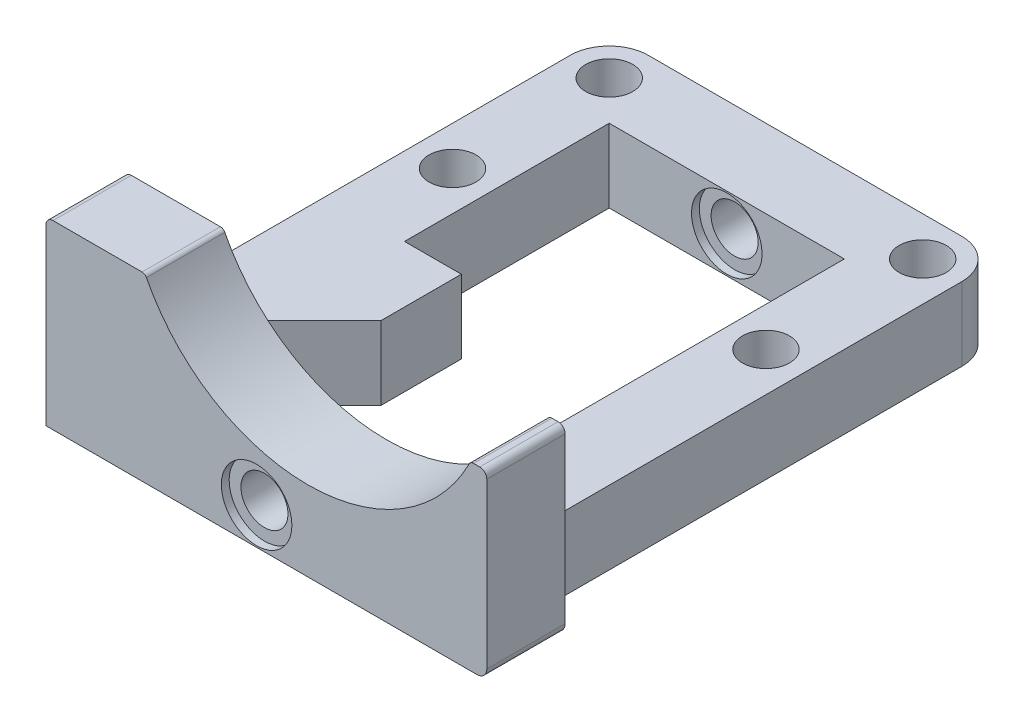
ISO-10303-21;
HEADER;
FILE_DESCRIPTION(('STEP AP214'),'2;1');
FILE_NAME('part.step','',(''),(''),'','','');
FILE_SCHEMA(('AUTOMOTIVE_DESIGN { 1 0 10303 214 1 1 1 1 }'));
ENDSEC;
DATA;
#1=APPLICATION_CONTEXT('core data for automotive mechanical design processes');
#2=APPLICATION_PROTOCOL_DEFINITION('international standard','automotive_design',2000,#1);
#3=PRODUCT_CONTEXT('',#1,'mechanical');
#4=PRODUCT('Part','Part','',(#3));
#5=PRODUCT_RELATED_PRODUCT_CATEGORY('part','',(#4));
#6=PRODUCT_DEFINITION_FORMATION('','',#4);
#7=PRODUCT_DEFINITION_CONTEXT('part definition',#1,'design');
#8=PRODUCT_DEFINITION('design','',#6,#7);
#9=PRODUCT_DEFINITION_SHAPE('','',#8);
#10=(LENGTH_UNIT() NAMED_UNIT(*) SI_UNIT(.MILLI.,.METRE.));
#11=(NAMED_UNIT(*) PLANE_ANGLE_UNIT() SI_UNIT($,.RADIAN.));
#12=(NAMED_UNIT(*) SI_UNIT($,.STERADIAN.) SOLID_ANGLE_UNIT());
#13=UNCERTAINTY_MEASURE_WITH_UNIT(LENGTH_MEASURE(1.E-05),#10,'distance_accuracy_value','');
#14=(GEOMETRIC_REPRESENTATION_CONTEXT(3) GLOBAL_UNCERTAINTY_ASSIGNED_CONTEXT((#13)) GLOBAL_UNIT_ASSIGNED_CONTEXT((#10,
#11,#12)) REPRESENTATION_CONTEXT('',''));
#15=CARTESIAN_POINT('',(0.,0.,0.));
#16=DIRECTION('',(0.,0.,1.));
#17=DIRECTION('',(1.,0.,0.));
#18=AXIS2_PLACEMENT_3D('',#15,#16,#17);
#19=CARTESIAN_POINT('',(-12.,8.,-146.));
#20=DIRECTION('',(-1.,0.,0.));
#21=DIRECTION('',(0.,1.,0.));
#22=AXIS2_PLACEMENT_3D('',#19,#20,#21);
#23=PLANE('',#22);
#24=DIRECTION('',(0.,0.,-1.));
#25=VECTOR('',#24,1.);
#26=CARTESIAN_POINT('',(-12.,0.25,-146.));
#27=LINE('',#26,#25);
#28=CARTESIAN_POINT('',(-12.,0.25,-136.));
#29=VERTEX_POINT('',#28);
#30=CARTESIAN_POINT('',(-12.,0.25,-141.1));
#31=VERTEX_POINT('',#30);
#32=EDGE_CURVE('E386',#29,#31,#27,.T.);
#33=ORIENTED_EDGE('',*,*,#32,.T.);
#34=DIRECTION('',(0.,1.,0.));
#35=VECTOR('',#34,1.);
#36=CARTESIAN_POINT('',(-12.,8.,-141.1));
#37=LINE('',#36,#35);
#38=CARTESIAN_POINT('',(-12.,7.75,-141.1));
#39=VERTEX_POINT('',#38);
#40=EDGE_CURVE('E478',#31,#39,#37,.T.);
#41=ORIENTED_EDGE('',*,*,#40,.T.);
#42=DIRECTION('',(0.,0.,1.));
#43=VECTOR('',#42,1.);
#44=CARTESIAN_POINT('',(-12.,7.75,-146.));
#45=LINE('',#44,#43);
#46=CARTESIAN_POINT('',(-12.,7.75,-136.));
#47=VERTEX_POINT('',#46);
#48=EDGE_CURVE('E363',#39,#47,#45,.T.);
#49=ORIENTED_EDGE('',*,*,#48,.T.);
#50=DIRECTION('',(0.,-1.,0.));
#51=VECTOR('',#50,1.);
#52=CARTESIAN_POINT('',(-12.,8.,-136.));
#53=LINE('',#52,#51);
#54=EDGE_CURVE('E439',#47,#29,#53,.T.);
#55=ORIENTED_EDGE('',*,*,#54,.T.);
#56=EDGE_LOOP('',(#33,#41,#49,#55));
#57=FACE_BOUND('',#56,.T.);
#58=ADVANCED_FACE('F43',(#57),#23,.F.);
#59=CARTESIAN_POINT('',(20.,8.,-144.));
#60=DIRECTION('',(-1.,0.,0.));
#61=DIRECTION('',(0.,0.,1.));
#62=AXIS2_PLACEMENT_3D('',#59,#60,#61);
#63=PLANE('',#62);
#64=DIRECTION('',(0.,1.,0.));
#65=VECTOR('',#64,1.);
#66=CARTESIAN_POINT('',(20.,8.,-136.));
#67=LINE('',#66,#65);
#68=CARTESIAN_POINT('',(20.,0.25,-136.));
#69=VERTEX_POINT('',#68);
#70=CARTESIAN_POINT('',(20.,7.75,-136.));
#71=VERTEX_POINT('',#70);
#72=EDGE_CURVE('E347',#69,#71,#67,.T.);
#73=ORIENTED_EDGE('',*,*,#72,.F.);
#74=DIRECTION('',(0.,0.,-1.));
#75=VECTOR('',#74,1.);
#76=CARTESIAN_POINT('',(20.,0.25,-144.));
#77=LINE('',#76,#75);
#78=CARTESIAN_POINT('',(20.,0.25,-180.));
#79=VERTEX_POINT('',#78);
#80=EDGE_CURVE('E380',#69,#79,#77,.T.);
#81=ORIENTED_EDGE('',*,*,#80,.T.);
#82=DIRECTION('',(0.,-1.,0.));
#83=VECTOR('',#82,1.);
#84=CARTESIAN_POINT('',(20.,8.,-180.));
#85=LINE('',#84,#83);
#86=CARTESIAN_POINT('',(20.,7.75,-180.));
#87=VERTEX_POINT('',#86);
#88=EDGE_CURVE('E408',#87,#79,#85,.T.);
#89=ORIENTED_EDGE('',*,*,#88,.F.);
#90=DIRECTION('',(0.,0.,1.));
#91=VECTOR('',#90,1.);
#92=CARTESIAN_POINT('',(20.,7.75,-144.));
#93=LINE('',#92,#91);
#94=EDGE_CURVE('E357',#87,#71,#93,.T.);
#95=ORIENTED_EDGE('',*,*,#94,.T.);
#96=EDGE_LOOP('',(#73,#81,#89,#95));
#97=FACE_BOUND('',#96,.T.);
#98=ADVANCED_FACE('F510',(#97),#63,.F.);
#99=CARTESIAN_POINT('',(-20.,8.,-144.));
#100=DIRECTION('',(1.,0.,0.));
#101=DIRECTION('',(0.,0.,1.));
#102=AXIS2_PLACEMENT_3D('',#99,#100,#101);
#103=PLANE('',#102);
#104=DIRECTION('',(0.,-1.,0.));
#105=VECTOR('',#104,1.);
#106=CARTESIAN_POINT('',(-20.,8.,-136.));
#107=LINE('',#106,#105);
#108=CARTESIAN_POINT('',(-20.,7.75,-136.));
#109=VERTEX_POINT('',#108);
#110=CARTESIAN_POINT('',(-20.,0.25,-136.));
#111=VERTEX_POINT('',#110);
#112=EDGE_CURVE('E325',#109,#111,#107,.T.);
#113=ORIENTED_EDGE('',*,*,#112,.F.);
#114=DIRECTION('',(0.,0.,-1.));
#115=VECTOR('',#114,1.);
#116=CARTESIAN_POINT('',(-20.,7.75,-144.));
#117=LINE('',#116,#115);
#118=CARTESIAN_POINT('',(-20.,7.75,-180.));
#119=VERTEX_POINT('',#118);
#120=EDGE_CURVE('E352',#109,#119,#117,.T.);
#121=ORIENTED_EDGE('',*,*,#120,.T.);
#122=DIRECTION('',(0.,-1.,0.));
#123=VECTOR('',#122,1.);
#124=CARTESIAN_POINT('',(-20.,8.,-180.));
#125=LINE('',#124,#123);
#126=CARTESIAN_POINT('',(-20.,0.25,-180.));
#127=VERTEX_POINT('',#126);
#128=EDGE_CURVE('E398',#119,#127,#125,.T.);
#129=ORIENTED_EDGE('',*,*,#128,.T.);
#130=DIRECTION('',(0.,0.,1.));
#131=VECTOR('',#130,1.);
#132=CARTESIAN_POINT('',(-20.,0.25,-144.));
#133=LINE('',#132,#131);
#134=EDGE_CURVE('E372',#127,#111,#133,.T.);
#135=ORIENTED_EDGE('',*,*,#134,.T.);
#136=EDGE_LOOP('',(#113,#121,#129,#135));
#137=FACE_BOUND('',#136,.T.);
#138=ADVANCED_FACE('F529',(#137),#103,.F.);
#139=CARTESIAN_POINT('',(0.,7.75,0.));
#140=DIRECTION('',(0.,-1.,0.));
#141=DIRECTION('',(0.,0.,-1.));
#142=AXIS2_PLACEMENT_3D('',#139,#140,#141);
#143=PLANE('',#142);
#144=ORIENTED_EDGE('',*,*,#48,.F.);
#145=DIRECTION('',(0.707106781186543,0.,-0.707106781186552));
#146=VECTOR('',#145,1.);
#147=CARTESIAN_POINT('',(-76.55,7.75,-76.5499999999991));
#148=LINE('',#147,#146);
#149=CARTESIAN_POINT('',(-6.2,7.75,-146.9));
#150=VERTEX_POINT('',#149);
#151=EDGE_CURVE('E225',#39,#150,#148,.T.);
#152=ORIENTED_EDGE('',*,*,#151,.T.);
#153=DIRECTION('',(0.,0.,-1.));
#154=VECTOR('',#153,1.);
#155=CARTESIAN_POINT('',(-6.2,7.75,-147.1));
#156=LINE('',#155,#154);
#157=CARTESIAN_POINT('',(-6.2,7.75,-155.1));
#158=VERTEX_POINT('',#157);
#159=EDGE_CURVE('E209',#150,#158,#156,.T.);
#160=ORIENTED_EDGE('',*,*,#159,.T.);
#161=DIRECTION('',(-1.,0.,0.));
#162=VECTOR('',#161,1.);
#163=CARTESIAN_POINT('',(-6.2,7.75,-155.1));
#164=LINE('',#163,#162);
#165=CARTESIAN_POINT('',(-12.,7.75,-155.1));
#166=VERTEX_POINT('',#165);
#167=EDGE_CURVE('E213',#158,#166,#164,.T.);
#168=ORIENTED_EDGE('',*,*,#167,.T.);
#169=CARTESIAN_POINT('',(-12.,7.75,-176.));
#170=VERTEX_POINT('',#169);
#171=EDGE_CURVE('E364',#170,#166,#45,.T.);
#172=ORIENTED_EDGE('',*,*,#171,.F.);
#173=DIRECTION('',(-1.,0.,0.));
#174=VECTOR('',#173,1.);
#175=CARTESIAN_POINT('',(6.,7.75,-176.));
#176=LINE('',#175,#174);
#177=CARTESIAN_POINT('',(12.,7.75,-176.));
#178=VERTEX_POINT('',#177);
#179=EDGE_CURVE('E360',#178,#170,#176,.T.);
#180=ORIENTED_EDGE('',*,*,#179,.F.);
#181=DIRECTION('',(0.,0.,-1.));
#182=VECTOR('',#181,1.);
#183=CARTESIAN_POINT('',(12.,7.75,-146.));
#184=LINE('',#183,#182);
#185=CARTESIAN_POINT('',(12.,7.75,-136.));
#186=VERTEX_POINT('',#185);
#187=EDGE_CURVE('E366',#186,#178,#184,.T.);
#188=ORIENTED_EDGE('',*,*,#187,.F.);
#189=DIRECTION('',(-1.,0.,0.));
#190=VECTOR('',#189,1.);
#191=CARTESIAN_POINT('',(0.,7.75,-136.));
#192=LINE('',#191,#190);
#193=EDGE_CURVE('E477',#71,#186,#192,.T.);
#194=ORIENTED_EDGE('',*,*,#193,.F.);
#195=ORIENTED_EDGE('',*,*,#94,.F.);
#196=CARTESIAN_POINT('',(16.,7.75,-180.));
#197=DIRECTION('',(0.,-1.,0.));
#198=DIRECTION('',(0.,0.,-1.));
#199=AXIS2_PLACEMENT_3D('',#196,#197,#198);
#200=CIRCLE('',#199,4.);
#201=CARTESIAN_POINT('',(16.,7.75,-184.));
#202=VERTEX_POINT('',#201);
#203=EDGE_CURVE('E354',#202,#87,#200,.T.);
#204=ORIENTED_EDGE('',*,*,#203,.F.);
#205=DIRECTION('',(1.,0.,0.));
#206=VECTOR('',#205,1.);
#207=CARTESIAN_POINT('',(6.,7.75,-184.));
#208=LINE('',#207,#206);
#209=CARTESIAN_POINT('',(-16.,7.75,-184.));
#210=VERTEX_POINT('',#209);
#211=EDGE_CURVE('E349',#210,#202,#208,.T.);
#212=ORIENTED_EDGE('',*,*,#211,.F.);
#213=CARTESIAN_POINT('',(-16.,7.75,-180.));
#214=DIRECTION('',(0.,-1.,0.));
#215=DIRECTION('',(0.,0.,-1.));
#216=AXIS2_PLACEMENT_3D('',#213,#214,#215);
#217=CIRCLE('',#216,4.);
#218=EDGE_CURVE('E472',#119,#210,#217,.T.);
#219=ORIENTED_EDGE('',*,*,#218,.F.);
#220=ORIENTED_EDGE('',*,*,#120,.F.);
#221=EDGE_CURVE('E475',#47,#109,#192,.T.);
#222=ORIENTED_EDGE('',*,*,#221,.F.);
#223=EDGE_LOOP('',(#144,#152,#160,#168,#172,#180,#188,#194,#195,#204,#212,#219,#220,#222));
#224=FACE_BOUND('',#223,.T.);
#225=CARTESIAN_POINT('',(16.,7.75,-180.));
#226=DIRECTION('',(0.,-1.,0.));
#227=DIRECTION('',(0.,0.,-1.));
#228=AXIS2_PLACEMENT_3D('',#225,#226,#227);
#229=CIRCLE('',#228,2.4);
#230=CARTESIAN_POINT('',(16.,7.75,-182.4));
#231=VERTEX_POINT('',#230);
#232=EDGE_CURVE('E254',#231,#231,#229,.F.);
#233=ORIENTED_EDGE('',*,*,#232,.F.);
#234=EDGE_LOOP('',(#233));
#235=FACE_BOUND('',#234,.T.);
#236=CARTESIAN_POINT('',(-16.,7.75,-180.));
#237=DIRECTION('',(0.,-1.,0.));
#238=DIRECTION('',(0.,0.,-1.));
#239=AXIS2_PLACEMENT_3D('',#236,#237,#238);
#240=CIRCLE('',#239,2.4);
#241=CARTESIAN_POINT('',(-16.,7.75,-182.4));
#242=VERTEX_POINT('',#241);
#243=EDGE_CURVE('E248',#242,#242,#240,.F.);
#244=ORIENTED_EDGE('',*,*,#243,.F.);
#245=EDGE_LOOP('',(#244));
#246=FACE_BOUND('',#245,.T.);
#247=CARTESIAN_POINT('',(-16.,7.75,-164.));
#248=DIRECTION('',(0.,-1.,0.));
#249=DIRECTION('',(0.,0.,-1.));
#250=AXIS2_PLACEMENT_3D('',#247,#248,#249);
#251=CIRCLE('',#250,2.4);
#252=CARTESIAN_POINT('',(-16.,7.75,-166.4));
#253=VERTEX_POINT('',#252);
#254=EDGE_CURVE('E242',#253,#253,#251,.F.);
#255=ORIENTED_EDGE('',*,*,#254,.F.);
#256=EDGE_LOOP('',(#255));
#257=FACE_BOUND('',#256,.T.);
#258=CARTESIAN_POINT('',(16.,7.75,-164.));
#259=DIRECTION('',(0.,-1.,0.));
#260=DIRECTION('',(0.,0.,-1.));
#261=AXIS2_PLACEMENT_3D('',#258,#259,#260);
#262=CIRCLE('',#261,2.4);
#263=CARTESIAN_POINT('',(16.,7.75,-166.4));
#264=VERTEX_POINT('',#263);
#265=EDGE_CURVE('E236',#264,#264,#262,.F.);
#266=ORIENTED_EDGE('',*,*,#265,.F.);
#267=EDGE_LOOP('',(#266));
#268=FACE_BOUND('',#267,.T.);
#269=ADVANCED_FACE('F223',(#224,#235,#246,#257,#268),#143,.F.);
#270=CARTESIAN_POINT('',(12.,8.,-146.));
#271=DIRECTION('',(1.,0.,0.));
#272=DIRECTION('',(0.,1.,0.));
#273=AXIS2_PLACEMENT_3D('',#270,#271,#272);
#274=PLANE('',#273);
#275=DIRECTION('',(0.,-1.,0.));
#276=VECTOR('',#275,1.);
#277=CARTESIAN_POINT('',(12.,8.,-136.));
#278=LINE('',#277,#276);
#279=CARTESIAN_POINT('',(12.,0.25,-136.));
#280=VERTEX_POINT('',#279);
#281=EDGE_CURVE('E466',#186,#280,#278,.T.);
#282=ORIENTED_EDGE('',*,*,#281,.F.);
#283=ORIENTED_EDGE('',*,*,#187,.T.);
#284=DIRECTION('',(0.,-1.,0.));
#285=VECTOR('',#284,1.);
#286=CARTESIAN_POINT('',(12.,8.,-176.));
#287=LINE('',#286,#285);
#288=CARTESIAN_POINT('',(12.,0.25,-176.));
#289=VERTEX_POINT('',#288);
#290=EDGE_CURVE('E436',#178,#289,#287,.T.);
#291=ORIENTED_EDGE('',*,*,#290,.T.);
#292=DIRECTION('',(0.,0.,1.));
#293=VECTOR('',#292,1.);
#294=CARTESIAN_POINT('',(12.,0.25,-146.));
#295=LINE('',#294,#293);
#296=EDGE_CURVE('E392',#289,#280,#295,.T.);
#297=ORIENTED_EDGE('',*,*,#296,.T.);
#298=EDGE_LOOP('',(#282,#283,#291,#297));
#299=FACE_BOUND('',#298,.T.);
#300=ADVANCED_FACE('F498',(#299),#274,.F.);
#301=CARTESIAN_POINT('',(6.,8.,-136.));
#302=DIRECTION('',(0.,0.,1.));
#303=DIRECTION('',(1.,0.,0.));
#304=AXIS2_PLACEMENT_3D('',#301,#302,#303);
#305=PLANE('',#304);
#306=CARTESIAN_POINT('',(0.,4.,-136.));
#307=DIRECTION('',(0.,0.,-1.));
#308=DIRECTION('',(0.,-1.,0.));
#309=AXIS2_PLACEMENT_3D('',#306,#307,#308);
#310=CIRCLE('',#309,3.6);
#311=CARTESIAN_POINT('',(0.,0.4,-136.));
#312=VERTEX_POINT('',#311);
#313=EDGE_CURVE('E454',#312,#312,#310,.T.);
#314=ORIENTED_EDGE('',*,*,#313,.F.);
#315=EDGE_LOOP('',(#314));
#316=FACE_BOUND('',#315,.T.);
#317=ORIENTED_EDGE('',*,*,#54,.F.);
#318=ORIENTED_EDGE('',*,*,#221,.T.);
#319=ORIENTED_EDGE('',*,*,#112,.T.);
#320=DIRECTION('',(1.,0.,0.));
#321=VECTOR('',#320,1.);
#322=CARTESIAN_POINT('',(-21.5,0.25,-136.));
#323=LINE('',#322,#321);
#324=CARTESIAN_POINT('',(-21.5,0.25,-136.));
#325=VERTEX_POINT('',#324);
#326=EDGE_CURVE('E258',#325,#111,#323,.T.);
#327=ORIENTED_EDGE('',*,*,#326,.F.);
#328=DIRECTION('',(0.,-1.,0.));
#329=VECTOR('',#328,1.);
#330=CARTESIAN_POINT('',(-21.5,0.25,-136.));
#331=LINE('',#330,#329);
#332=CARTESIAN_POINT('',(-21.5,18.0311119897451,-136.));
#333=VERTEX_POINT('',#332);
#334=EDGE_CURVE('E289',#333,#325,#331,.T.);
#335=ORIENTED_EDGE('',*,*,#334,.F.);
#336=CARTESIAN_POINT('',(-20.7811119897452,18.0311119897451,-136.));
#337=DIRECTION('',(0.,0.,1.));
#338=DIRECTION('',(-1.,0.,0.));
#339=AXIS2_PLACEMENT_3D('',#336,#337,#338);
#340=CIRCLE('',#339,0.718888010254848);
#341=CARTESIAN_POINT('',(-20.7811119897452,18.75,-136.));
#342=VERTEX_POINT('',#341);
#343=EDGE_CURVE('E286',#342,#333,#340,.T.);
#344=ORIENTED_EDGE('',*,*,#343,.F.);
#345=DIRECTION('',(-1.,0.,0.));
#346=VECTOR('',#345,1.);
#347=CARTESIAN_POINT('',(-20.7811119897452,18.75,-136.));
#348=LINE('',#347,#346);
#349=CARTESIAN_POINT('',(-11.6914352214865,18.75,-136.));
#350=VERTEX_POINT('',#349);
#351=EDGE_CURVE('E283',#350,#342,#348,.T.);
#352=ORIENTED_EDGE('',*,*,#351,.F.);
#353=CARTESIAN_POINT('',(-11.6914352214865,18.25,-136.));
#354=DIRECTION('',(0.,0.,1.));
#355=DIRECTION('',(1.,0.,0.));
#356=AXIS2_PLACEMENT_3D('',#353,#354,#355);
#357=CIRCLE('',#356,0.499999999999999);
#358=CARTESIAN_POINT('',(-11.2462152044827,18.4775502943507,-136.));
#359=VERTEX_POINT('',#358);
#360=EDGE_CURVE('E280',#359,#350,#357,.T.);
#361=ORIENTED_EDGE('',*,*,#360,.F.);
#362=CARTESIAN_POINT('',(5.22692542465987,26.8969111853265,-136.));
#363=DIRECTION('',(0.,0.,-1.));
#364=DIRECTION('',(1.,0.,0.));
#365=AXIS2_PLACEMENT_3D('',#362,#363,#364);
#366=CIRCLE('',#365,18.5);
#367=CARTESIAN_POINT('',(21.7000660538024,18.4775502943507,-136.));
#368=VERTEX_POINT('',#367);
#369=EDGE_CURVE('E277',#368,#359,#366,.T.);
#370=ORIENTED_EDGE('',*,*,#369,.F.);
#371=CARTESIAN_POINT('',(22.1452860708063,18.25,-136.));
#372=DIRECTION('',(0.,0.,1.));
#373=DIRECTION('',(-1.,0.,0.));
#374=AXIS2_PLACEMENT_3D('',#371,#372,#373);
#375=CIRCLE('',#374,0.499999999999995);
#376=CARTESIAN_POINT('',(22.1452860708063,18.75,-136.));
#377=VERTEX_POINT('',#376);
#378=EDGE_CURVE('E274',#377,#368,#375,.T.);
#379=ORIENTED_EDGE('',*,*,#378,.F.);
#380=DIRECTION('',(-1.,0.,0.));
#381=VECTOR('',#380,1.);
#382=CARTESIAN_POINT('',(22.7811119897451,18.75,-136.));
#383=LINE('',#382,#381);
#384=CARTESIAN_POINT('',(22.7811119897451,18.75,-136.));
#385=VERTEX_POINT('',#384);
#386=EDGE_CURVE('E271',#385,#377,#383,.T.);
#387=ORIENTED_EDGE('',*,*,#386,.F.);
#388=CARTESIAN_POINT('',(22.7811119897451,18.0311119897451,-136.));
#389=DIRECTION('',(0.,0.,1.));
#390=DIRECTION('',(1.,0.,0.));
#391=AXIS2_PLACEMENT_3D('',#388,#389,#390);
#392=CIRCLE('',#391,0.718888010254852);
#393=CARTESIAN_POINT('',(23.5,18.0311119897451,-136.));
#394=VERTEX_POINT('',#393);
#395=EDGE_CURVE('E268',#394,#385,#392,.T.);
#396=ORIENTED_EDGE('',*,*,#395,.F.);
#397=DIRECTION('',(0.,1.,0.));
#398=VECTOR('',#397,1.);
#399=CARTESIAN_POINT('',(23.5,1.25,-136.));
#400=LINE('',#399,#398);
#401=CARTESIAN_POINT('',(23.5,1.25,-136.));
#402=VERTEX_POINT('',#401);
#403=EDGE_CURVE('E265',#402,#394,#400,.T.);
#404=ORIENTED_EDGE('',*,*,#403,.F.);
#405=CARTESIAN_POINT('',(22.5,1.25,-136.));
#406=DIRECTION('',(0.,0.,1.));
#407=DIRECTION('',(1.,0.,0.));
#408=AXIS2_PLACEMENT_3D('',#405,#406,#407);
#409=CIRCLE('',#408,0.999999999999999);
#410=CARTESIAN_POINT('',(22.5,0.250000000000001,-136.));
#411=VERTEX_POINT('',#410);
#412=EDGE_CURVE('E261',#411,#402,#409,.T.);
#413=ORIENTED_EDGE('',*,*,#412,.F.);
#414=EDGE_CURVE('E262',#69,#411,#323,.T.);
#415=ORIENTED_EDGE('',*,*,#414,.F.);
#416=ORIENTED_EDGE('',*,*,#72,.T.);
#417=ORIENTED_EDGE('',*,*,#193,.T.);
#418=ORIENTED_EDGE('',*,*,#281,.T.);
#419=DIRECTION('',(-1.,0.,0.));
#420=VECTOR('',#419,1.);
#421=CARTESIAN_POINT('',(6.,0.25,-136.));
#422=LINE('',#421,#420);
#423=EDGE_CURVE('E389',#280,#29,#422,.T.);
#424=ORIENTED_EDGE('',*,*,#423,.T.);
#425=EDGE_LOOP('',(#317,#318,#319,#327,#335,#344,#352,#361,#370,#379,#387,#396,#404,#413,#415,
#416,#417,#418,#424));
#426=FACE_BOUND('',#425,.T.);
#427=ADVANCED_FACE('F492',(#316,#426),#305,.F.);
#428=CARTESIAN_POINT('',(6.,8.,-128.));
#429=DIRECTION('',(0.,0.,-1.));
#430=DIRECTION('',(0.,1.,0.));
#431=AXIS2_PLACEMENT_3D('',#428,#429,#430);
#432=PLANE('',#431);
#433=DIRECTION('',(1.,0.,0.));
#434=VECTOR('',#433,1.);
#435=CARTESIAN_POINT('',(6.,0.25,-128.));
#436=LINE('',#435,#434);
#437=CARTESIAN_POINT('',(-21.5,0.25,-128.));
#438=VERTEX_POINT('',#437);
#439=CARTESIAN_POINT('',(22.5,0.250000000000001,-128.));
#440=VERTEX_POINT('',#439);
#441=EDGE_CURVE('E378',#438,#440,#436,.T.);
#442=ORIENTED_EDGE('',*,*,#441,.T.);
#443=CARTESIAN_POINT('',(22.5,1.25,-128.));
#444=DIRECTION('',(0.,0.,1.));
#445=DIRECTION('',(1.,0.,0.));
#446=AXIS2_PLACEMENT_3D('',#443,#444,#445);
#447=CIRCLE('',#446,0.999999999999999);
#448=CARTESIAN_POINT('',(23.5,1.25,-128.));
#449=VERTEX_POINT('',#448);
#450=EDGE_CURVE('E257',#440,#449,#447,.T.);
#451=ORIENTED_EDGE('',*,*,#450,.T.);
#452=DIRECTION('',(0.,1.,0.));
#453=VECTOR('',#452,1.);
#454=CARTESIAN_POINT('',(23.5,1.25,-128.));
#455=LINE('',#454,#453);
#456=CARTESIAN_POINT('',(23.5,18.0311119897451,-128.));
#457=VERTEX_POINT('',#456);
#458=EDGE_CURVE('E295',#449,#457,#455,.T.);
#459=ORIENTED_EDGE('',*,*,#458,.T.);
#460=CARTESIAN_POINT('',(22.7811119897451,18.0311119897451,-128.));
#461=DIRECTION('',(0.,0.,1.));
#462=DIRECTION('',(1.,0.,0.));
#463=AXIS2_PLACEMENT_3D('',#460,#461,#462);
#464=CIRCLE('',#463,0.718888010254852);
#465=CARTESIAN_POINT('',(22.7811119897451,18.75,-128.));
#466=VERTEX_POINT('',#465);
#467=EDGE_CURVE('E298',#457,#466,#464,.T.);
#468=ORIENTED_EDGE('',*,*,#467,.T.);
#469=DIRECTION('',(-1.,0.,0.));
#470=VECTOR('',#469,1.);
#471=CARTESIAN_POINT('',(22.7811119897451,18.75,-128.));
#472=LINE('',#471,#470);
#473=CARTESIAN_POINT('',(22.1452860708063,18.75,-128.));
#474=VERTEX_POINT('',#473);
#475=EDGE_CURVE('E301',#466,#474,#472,.T.);
#476=ORIENTED_EDGE('',*,*,#475,.T.);
#477=CARTESIAN_POINT('',(22.1452860708063,18.25,-128.));
#478=DIRECTION('',(0.,0.,1.));
#479=DIRECTION('',(-1.,0.,0.));
#480=AXIS2_PLACEMENT_3D('',#477,#478,#479);
#481=CIRCLE('',#480,0.499999999999995);
#482=CARTESIAN_POINT('',(21.7000660538024,18.4775502943507,-128.));
#483=VERTEX_POINT('',#482);
#484=EDGE_CURVE('E304',#474,#483,#481,.T.);
#485=ORIENTED_EDGE('',*,*,#484,.T.);
#486=CARTESIAN_POINT('',(5.22692542465987,26.8969111853265,-128.));
#487=DIRECTION('',(0.,0.,-1.));
#488=DIRECTION('',(1.,0.,0.));
#489=AXIS2_PLACEMENT_3D('',#486,#487,#488);
#490=CIRCLE('',#489,18.5);
#491=CARTESIAN_POINT('',(-11.2462152044827,18.4775502943507,-128.));
#492=VERTEX_POINT('',#491);
#493=EDGE_CURVE('E307',#483,#492,#490,.T.);
#494=ORIENTED_EDGE('',*,*,#493,.T.);
#495=CARTESIAN_POINT('',(-11.6914352214865,18.25,-128.));
#496=DIRECTION('',(0.,0.,1.));
#497=DIRECTION('',(1.,0.,0.));
#498=AXIS2_PLACEMENT_3D('',#495,#496,#497);
#499=CIRCLE('',#498,0.499999999999999);
#500=CARTESIAN_POINT('',(-11.6914352214865,18.75,-128.));
#501=VERTEX_POINT('',#500);
#502=EDGE_CURVE('E310',#492,#501,#499,.T.);
#503=ORIENTED_EDGE('',*,*,#502,.T.);
#504=DIRECTION('',(-1.,0.,0.));
#505=VECTOR('',#504,1.);
#506=CARTESIAN_POINT('',(-20.7811119897452,18.75,-128.));
#507=LINE('',#506,#505);
#508=CARTESIAN_POINT('',(-20.7811119897452,18.75,-128.));
#509=VERTEX_POINT('',#508);
#510=EDGE_CURVE('E313',#501,#509,#507,.T.);
#511=ORIENTED_EDGE('',*,*,#510,.T.);
#512=CARTESIAN_POINT('',(-20.7811119897452,18.0311119897451,-128.));
#513=DIRECTION('',(0.,0.,1.));
#514=DIRECTION('',(-1.,0.,0.));
#515=AXIS2_PLACEMENT_3D('',#512,#513,#514);
#516=CIRCLE('',#515,0.718888010254848);
#517=CARTESIAN_POINT('',(-21.5,18.0311119897451,-128.));
#518=VERTEX_POINT('',#517);
#519=EDGE_CURVE('E316',#509,#518,#516,.T.);
#520=ORIENTED_EDGE('',*,*,#519,.T.);
#521=DIRECTION('',(0.,-1.,0.));
#522=VECTOR('',#521,1.);
#523=CARTESIAN_POINT('',(-21.5,0.25,-128.));
#524=LINE('',#523,#522);
#525=EDGE_CURVE('E319',#518,#438,#524,.T.);
#526=ORIENTED_EDGE('',*,*,#525,.T.);
#527=EDGE_LOOP('',(#442,#451,#459,#468,#476,#485,#494,#503,#511,#520,#526));
#528=FACE_BOUND('',#527,.T.);
#529=CARTESIAN_POINT('',(0.,4.,-128.));
#530=DIRECTION('',(0.,0.,-1.));
#531=DIRECTION('',(0.,-1.,0.));
#532=AXIS2_PLACEMENT_3D('',#529,#530,#531);
#533=CIRCLE('',#532,3.6);
#534=CARTESIAN_POINT('',(0.,0.4,-128.));
#535=VERTEX_POINT('',#534);
#536=EDGE_CURVE('E442',#535,#535,#533,.T.);
#537=ORIENTED_EDGE('',*,*,#536,.T.);
#538=EDGE_LOOP('',(#537));
#539=FACE_BOUND('',#538,.T.);
#540=ADVANCED_FACE('F573',(#528,#539),#432,.F.);
#541=CARTESIAN_POINT('',(0.,4.,-132.));
#542=DIRECTION('',(0.,0.,-1.));
#543=DIRECTION('',(0.,-1.,0.));
#544=AXIS2_PLACEMENT_3D('',#541,#542,#543);
#545=CYLINDRICAL_SURFACE('',#544,2.4);
#546=CARTESIAN_POINT('',(0.,4.,-128.8));
#547=DIRECTION('',(0.,0.,-1.));
#548=DIRECTION('',(0.,-1.,0.));
#549=AXIS2_PLACEMENT_3D('',#546,#547,#548);
#550=CIRCLE('',#549,2.4);
#551=CARTESIAN_POINT('',(0.,1.6,-128.8));
#552=VERTEX_POINT('',#551);
#553=EDGE_CURVE('E450',#552,#552,#550,.T.);
#554=ORIENTED_EDGE('',*,*,#553,.F.);
#555=EDGE_LOOP('',(#554));
#556=FACE_BOUND('',#555,.T.);
#557=CARTESIAN_POINT('',(0.,4.,-135.2));
#558=DIRECTION('',(0.,0.,-1.));
#559=DIRECTION('',(0.,-1.,0.));
#560=AXIS2_PLACEMENT_3D('',#557,#558,#559);
#561=CIRCLE('',#560,2.4);
#562=CARTESIAN_POINT('',(0.,1.6,-135.2));
#563=VERTEX_POINT('',#562);
#564=EDGE_CURVE('E462',#563,#563,#561,.T.);
#565=ORIENTED_EDGE('',*,*,#564,.T.);
#566=EDGE_LOOP('',(#565));
#567=FACE_BOUND('',#566,.T.);
#568=ADVANCED_FACE('F576',(#556,#567),#545,.F.);
#569=CARTESIAN_POINT('',(0.,1.00000000000002,-135.2));
#570=DIRECTION('',(0.,0.,1.));
#571=DIRECTION('',(0.,1.,0.));
#572=AXIS2_PLACEMENT_3D('',#569,#570,#571);
#573=PLANE('',#572);
#574=ORIENTED_EDGE('',*,*,#564,.F.);
#575=EDGE_LOOP('',(#574));
#576=FACE_BOUND('',#575,.T.);
#577=CARTESIAN_POINT('',(0.,4.,-135.2));
#578=DIRECTION('',(0.,0.,-1.));
#579=DIRECTION('',(0.,-1.,0.));
#580=AXIS2_PLACEMENT_3D('',#577,#578,#579);
#581=CIRCLE('',#580,3.6);
#582=CARTESIAN_POINT('',(0.,0.4,-135.2));
#583=VERTEX_POINT('',#582);
#584=EDGE_CURVE('E458',#583,#583,#581,.T.);
#585=ORIENTED_EDGE('',*,*,#584,.T.);
#586=EDGE_LOOP('',(#585));
#587=FACE_BOUND('',#586,.T.);
#588=ADVANCED_FACE('F595',(#576,#587),#573,.F.);
#589=CARTESIAN_POINT('',(0.,4.,-132.));
#590=DIRECTION('',(0.,0.,-1.));
#591=DIRECTION('',(0.,-1.,0.));
#592=AXIS2_PLACEMENT_3D('',#589,#590,#591);
#593=CYLINDRICAL_SURFACE('',#592,3.6);
#594=ORIENTED_EDGE('',*,*,#584,.F.);
#595=EDGE_LOOP('',(#594));
#596=FACE_BOUND('',#595,.T.);
#597=ORIENTED_EDGE('',*,*,#313,.T.);
#598=EDGE_LOOP('',(#597));
#599=FACE_BOUND('',#598,.T.);
#600=ADVANCED_FACE('F589',(#596,#599),#593,.F.);
#601=CARTESIAN_POINT('',(0.,1.00000000000002,-128.8));
#602=DIRECTION('',(0.,0.,-1.));
#603=DIRECTION('',(0.,1.,0.));
#604=AXIS2_PLACEMENT_3D('',#601,#602,#603);
#605=PLANE('',#604);
#606=CARTESIAN_POINT('',(0.,4.,-128.8));
#607=DIRECTION('',(0.,0.,-1.));
#608=DIRECTION('',(0.,-1.,0.));
#609=AXIS2_PLACEMENT_3D('',#606,#607,#608);
#610=CIRCLE('',#609,3.6);
#611=CARTESIAN_POINT('',(0.,0.4,-128.8));
#612=VERTEX_POINT('',#611);
#613=EDGE_CURVE('E446',#612,#612,#610,.T.);
#614=ORIENTED_EDGE('',*,*,#613,.F.);
#615=EDGE_LOOP('',(#614));
#616=FACE_BOUND('',#615,.T.);
#617=ORIENTED_EDGE('',*,*,#553,.T.);
#618=EDGE_LOOP('',(#617));
#619=FACE_BOUND('',#618,.T.);
#620=ADVANCED_FACE('F583',(#616,#619),#605,.F.);
#621=CARTESIAN_POINT('',(0.,4.,-132.));
#622=DIRECTION('',(0.,0.,1.));
#623=DIRECTION('',(0.,-1.,0.));
#624=AXIS2_PLACEMENT_3D('',#621,#622,#623);
#625=CYLINDRICAL_SURFACE('',#624,3.6);
#626=ORIENTED_EDGE('',*,*,#536,.F.);
#627=EDGE_LOOP('',(#626));
#628=FACE_BOUND('',#627,.T.);
#629=ORIENTED_EDGE('',*,*,#613,.T.);
#630=EDGE_LOOP('',(#629));
#631=FACE_BOUND('',#630,.T.);
#632=ADVANCED_FACE('F580',(#628,#631),#625,.F.);
#633=ORIENTED_EDGE('',*,*,#171,.T.);
#634=DIRECTION('',(0.,-1.,0.));
#635=VECTOR('',#634,1.);
#636=CARTESIAN_POINT('',(-12.,8.,-155.1));
#637=LINE('',#636,#635);
#638=CARTESIAN_POINT('',(-12.,0.25,-155.1));
#639=VERTEX_POINT('',#638);
#640=EDGE_CURVE('E219',#166,#639,#637,.T.);
#641=ORIENTED_EDGE('',*,*,#640,.T.);
#642=CARTESIAN_POINT('',(-12.,0.25,-176.));
#643=VERTEX_POINT('',#642);
#644=EDGE_CURVE('E385',#639,#643,#27,.T.);
#645=ORIENTED_EDGE('',*,*,#644,.T.);
#646=DIRECTION('',(0.,-1.,0.));
#647=VECTOR('',#646,1.);
#648=CARTESIAN_POINT('',(-12.,8.,-176.));
#649=LINE('',#648,#647);
#650=EDGE_CURVE('E401',#170,#643,#649,.T.);
#651=ORIENTED_EDGE('',*,*,#650,.F.);
#652=EDGE_LOOP('',(#633,#641,#645,#651));
#653=FACE_BOUND('',#652,.T.);
#654=ADVANCED_FACE('F505',(#653),#23,.F.);
#655=CARTESIAN_POINT('',(6.,8.,-176.));
#656=DIRECTION('',(0.,0.,-1.));
#657=DIRECTION('',(1.,0.,0.));
#658=AXIS2_PLACEMENT_3D('',#655,#656,#657);
#659=PLANE('',#658);
#660=CARTESIAN_POINT('',(0.,4.,-176.));
#661=DIRECTION('',(0.,0.,-1.));
#662=DIRECTION('',(0.,-1.,0.));
#663=AXIS2_PLACEMENT_3D('',#660,#661,#662);
#664=CIRCLE('',#663,3.6);
#665=CARTESIAN_POINT('',(0.,0.4,-176.));
#666=VERTEX_POINT('',#665);
#667=EDGE_CURVE('E424',#666,#666,#664,.T.);
#668=ORIENTED_EDGE('',*,*,#667,.T.);
#669=EDGE_LOOP('',(#668));
#670=FACE_BOUND('',#669,.T.);
#671=ORIENTED_EDGE('',*,*,#290,.F.);
#672=ORIENTED_EDGE('',*,*,#179,.T.);
#673=ORIENTED_EDGE('',*,*,#650,.T.);
#674=DIRECTION('',(1.,0.,0.));
#675=VECTOR('',#674,1.);
#676=CARTESIAN_POINT('',(6.,0.25,-176.));
#677=LINE('',#676,#675);
#678=EDGE_CURVE('E382',#643,#289,#677,.T.);
#679=ORIENTED_EDGE('',*,*,#678,.T.);
#680=EDGE_LOOP('',(#671,#672,#673,#679));
#681=FACE_BOUND('',#680,.T.);
#682=ADVANCED_FACE('F502',(#670,#681),#659,.F.);
#683=CARTESIAN_POINT('',(6.,8.,-184.));
#684=DIRECTION('',(0.,0.,1.));
#685=DIRECTION('',(0.,1.,0.));
#686=AXIS2_PLACEMENT_3D('',#683,#684,#685);
#687=PLANE('',#686);
#688=CARTESIAN_POINT('',(0.,4.,-184.));
#689=DIRECTION('',(0.,0.,-1.));
#690=DIRECTION('',(0.,-1.,0.));
#691=AXIS2_PLACEMENT_3D('',#688,#689,#690);
#692=CIRCLE('',#691,3.6);
#693=CARTESIAN_POINT('',(0.,0.4,-184.));
#694=VERTEX_POINT('',#693);
#695=EDGE_CURVE('E412',#694,#694,#692,.T.);
#696=ORIENTED_EDGE('',*,*,#695,.F.);
#697=EDGE_LOOP('',(#696));
#698=FACE_BOUND('',#697,.T.);
#699=DIRECTION('',(0.,-1.,0.));
#700=VECTOR('',#699,1.);
#701=CARTESIAN_POINT('',(-16.,8.,-184.));
#702=LINE('',#701,#700);
#703=CARTESIAN_POINT('',(-16.,0.25,-184.));
#704=VERTEX_POINT('',#703);
#705=EDGE_CURVE('E395',#210,#704,#702,.T.);
#706=ORIENTED_EDGE('',*,*,#705,.F.);
#707=ORIENTED_EDGE('',*,*,#211,.T.);
#708=DIRECTION('',(0.,-1.,0.));
#709=VECTOR('',#708,1.);
#710=CARTESIAN_POINT('',(16.,8.,-184.));
#711=LINE('',#710,#709);
#712=CARTESIAN_POINT('',(16.,0.25,-184.));
#713=VERTEX_POINT('',#712);
#714=EDGE_CURVE('E405',#202,#713,#711,.T.);
#715=ORIENTED_EDGE('',*,*,#714,.T.);
#716=DIRECTION('',(-1.,0.,0.));
#717=VECTOR('',#716,1.);
#718=CARTESIAN_POINT('',(6.,0.25,-184.));
#719=LINE('',#718,#717);
#720=EDGE_CURVE('E369',#713,#704,#719,.T.);
#721=ORIENTED_EDGE('',*,*,#720,.T.);
#722=EDGE_LOOP('',(#706,#707,#715,#721));
#723=FACE_BOUND('',#722,.T.);
#724=ADVANCED_FACE('F522',(#698,#723),#687,.F.);
#725=CARTESIAN_POINT('',(0.,4.,-180.));
#726=DIRECTION('',(0.,0.,1.));
#727=DIRECTION('',(0.,-1.,0.));
#728=AXIS2_PLACEMENT_3D('',#725,#726,#727);
#729=CYLINDRICAL_SURFACE('',#728,2.4);
#730=CARTESIAN_POINT('',(0.,4.,-183.2));
#731=DIRECTION('',(0.,0.,-1.));
#732=DIRECTION('',(0.,-1.,0.));
#733=AXIS2_PLACEMENT_3D('',#730,#731,#732);
#734=CIRCLE('',#733,2.4);
#735=CARTESIAN_POINT('',(0.,1.6,-183.2));
#736=VERTEX_POINT('',#735);
#737=EDGE_CURVE('E420',#736,#736,#734,.T.);
#738=ORIENTED_EDGE('',*,*,#737,.T.);
#739=EDGE_LOOP('',(#738));
#740=FACE_BOUND('',#739,.T.);
#741=CARTESIAN_POINT('',(0.,4.,-176.8));
#742=DIRECTION('',(0.,0.,-1.));
#743=DIRECTION('',(0.,-1.,0.));
#744=AXIS2_PLACEMENT_3D('',#741,#742,#743);
#745=CIRCLE('',#744,2.4);
#746=CARTESIAN_POINT('',(0.,1.6,-176.8));
#747=VERTEX_POINT('',#746);
#748=EDGE_CURVE('E432',#747,#747,#745,.T.);
#749=ORIENTED_EDGE('',*,*,#748,.F.);
#750=EDGE_LOOP('',(#749));
#751=FACE_BOUND('',#750,.T.);
#752=ADVANCED_FACE('F631',(#740,#751),#729,.F.);
#753=CARTESIAN_POINT('',(0.,1.00000000000002,-176.8));
#754=DIRECTION('',(0.,0.,-1.));
#755=DIRECTION('',(0.,1.,0.));
#756=AXIS2_PLACEMENT_3D('',#753,#754,#755);
#757=PLANE('',#756);
#758=ORIENTED_EDGE('',*,*,#748,.T.);
#759=EDGE_LOOP('',(#758));
#760=FACE_BOUND('',#759,.T.);
#761=CARTESIAN_POINT('',(0.,4.,-176.8));
#762=DIRECTION('',(0.,0.,-1.));
#763=DIRECTION('',(0.,-1.,0.));
#764=AXIS2_PLACEMENT_3D('',#761,#762,#763);
#765=CIRCLE('',#764,3.6);
#766=CARTESIAN_POINT('',(0.,0.4,-176.8));
#767=VERTEX_POINT('',#766);
#768=EDGE_CURVE('E428',#767,#767,#765,.T.);
#769=ORIENTED_EDGE('',*,*,#768,.F.);
#770=EDGE_LOOP('',(#769));
#771=FACE_BOUND('',#770,.T.);
#772=ADVANCED_FACE('F637',(#760,#771),#757,.F.);
#773=CARTESIAN_POINT('',(0.,4.,-180.));
#774=DIRECTION('',(0.,0.,1.));
#775=DIRECTION('',(0.,-1.,0.));
#776=AXIS2_PLACEMENT_3D('',#773,#774,#775);
#777=CYLINDRICAL_SURFACE('',#776,3.6);
#778=ORIENTED_EDGE('',*,*,#768,.T.);
#779=EDGE_LOOP('',(#778));
#780=FACE_BOUND('',#779,.T.);
#781=ORIENTED_EDGE('',*,*,#667,.F.);
#782=EDGE_LOOP('',(#781));
#783=FACE_BOUND('',#782,.T.);
#784=ADVANCED_FACE('F641',(#780,#783),#777,.F.);
#785=CARTESIAN_POINT('',(0.,1.00000000000002,-183.2));
#786=DIRECTION('',(0.,0.,1.));
#787=DIRECTION('',(0.,1.,0.));
#788=AXIS2_PLACEMENT_3D('',#785,#786,#787);
#789=PLANE('',#788);
#790=CARTESIAN_POINT('',(0.,4.,-183.2));
#791=DIRECTION('',(0.,0.,-1.));
#792=DIRECTION('',(0.,-1.,0.));
#793=AXIS2_PLACEMENT_3D('',#790,#791,#792);
#794=CIRCLE('',#793,3.6);
#795=CARTESIAN_POINT('',(0.,0.4,-183.2));
#796=VERTEX_POINT('',#795);
#797=EDGE_CURVE('E416',#796,#796,#794,.T.);
#798=ORIENTED_EDGE('',*,*,#797,.T.);
#799=EDGE_LOOP('',(#798));
#800=FACE_BOUND('',#799,.T.);
#801=ORIENTED_EDGE('',*,*,#737,.F.);
#802=EDGE_LOOP('',(#801));
#803=FACE_BOUND('',#802,.T.);
#804=ADVANCED_FACE('F645',(#800,#803),#789,.F.);
#805=CARTESIAN_POINT('',(0.,4.,-180.));
#806=DIRECTION('',(0.,0.,-1.));
#807=DIRECTION('',(0.,-1.,0.));
#808=AXIS2_PLACEMENT_3D('',#805,#806,#807);
#809=CYLINDRICAL_SURFACE('',#808,3.6);
#810=ORIENTED_EDGE('',*,*,#695,.T.);
#811=EDGE_LOOP('',(#810));
#812=FACE_BOUND('',#811,.T.);
#813=ORIENTED_EDGE('',*,*,#797,.F.);
#814=EDGE_LOOP('',(#813));
#815=FACE_BOUND('',#814,.T.);
#816=ADVANCED_FACE('F649',(#812,#815),#809,.F.);
#817=CARTESIAN_POINT('',(16.,8.,-180.));
#818=DIRECTION('',(0.,-1.,0.));
#819=DIRECTION('',(0.,0.,1.));
#820=AXIS2_PLACEMENT_3D('',#817,#818,#819);
#821=CYLINDRICAL_SURFACE('',#820,4.);
#822=ORIENTED_EDGE('',*,*,#714,.F.);
#823=ORIENTED_EDGE('',*,*,#203,.T.);
#824=ORIENTED_EDGE('',*,*,#88,.T.);
#825=CARTESIAN_POINT('',(16.,0.25,-180.));
#826=DIRECTION('',(0.,1.,0.));
#827=DIRECTION('',(0.,0.,1.));
#828=AXIS2_PLACEMENT_3D('',#825,#826,#827);
#829=CIRCLE('',#828,4.);
#830=EDGE_CURVE('E375',#79,#713,#829,.T.);
#831=ORIENTED_EDGE('',*,*,#830,.T.);
#832=EDGE_LOOP('',(#822,#823,#824,#831));
#833=FACE_BOUND('',#832,.T.);
#834=ADVANCED_FACE('F515',(#833),#821,.T.);
#835=CARTESIAN_POINT('',(-16.,8.,-180.));
#836=DIRECTION('',(0.,-1.,0.));
#837=DIRECTION('',(0.,0.,1.));
#838=AXIS2_PLACEMENT_3D('',#835,#836,#837);
#839=CYLINDRICAL_SURFACE('',#838,4.);
#840=ORIENTED_EDGE('',*,*,#128,.F.);
#841=ORIENTED_EDGE('',*,*,#218,.T.);
#842=ORIENTED_EDGE('',*,*,#705,.T.);
#843=CARTESIAN_POINT('',(-16.,0.25,-180.));
#844=DIRECTION('',(0.,1.,0.));
#845=DIRECTION('',(0.,0.,1.));
#846=AXIS2_PLACEMENT_3D('',#843,#844,#845);
#847=CIRCLE('',#846,4.);
#848=EDGE_CURVE('E469',#704,#127,#847,.T.);
#849=ORIENTED_EDGE('',*,*,#848,.T.);
#850=EDGE_LOOP('',(#840,#841,#842,#849));
#851=FACE_BOUND('',#850,.T.);
#852=ADVANCED_FACE('F527',(#851),#839,.T.);
#853=CARTESIAN_POINT('',(0.,0.25,0.));
#854=DIRECTION('',(0.,1.,0.));
#855=DIRECTION('',(0.,0.,1.));
#856=AXIS2_PLACEMENT_3D('',#853,#854,#855);
#857=PLANE('',#856);
#858=ORIENTED_EDGE('',*,*,#644,.F.);
#859=DIRECTION('',(1.,0.,0.));
#860=VECTOR('',#859,1.);
#861=CARTESIAN_POINT('',(-6.2,0.25,-155.1));
#862=LINE('',#861,#860);
#863=CARTESIAN_POINT('',(-6.2,0.25,-155.1));
#864=VERTEX_POINT('',#863);
#865=EDGE_CURVE('E230',#639,#864,#862,.T.);
#866=ORIENTED_EDGE('',*,*,#865,.T.);
#867=DIRECTION('',(0.,0.,1.));
#868=VECTOR('',#867,1.);
#869=CARTESIAN_POINT('',(-6.2,0.25,-147.1));
#870=LINE('',#869,#868);
#871=CARTESIAN_POINT('',(-6.2,0.25,-146.9));
#872=VERTEX_POINT('',#871);
#873=EDGE_CURVE('E58',#864,#872,#870,.T.);
#874=ORIENTED_EDGE('',*,*,#873,.T.);
#875=DIRECTION('',(-0.707106781186543,0.,0.707106781186552));
#876=VECTOR('',#875,1.);
#877=CARTESIAN_POINT('',(-76.55,0.25,-76.5499999999991));
#878=LINE('',#877,#876);
#879=EDGE_CURVE('E11',#872,#31,#878,.T.);
#880=ORIENTED_EDGE('',*,*,#879,.T.);
#881=ORIENTED_EDGE('',*,*,#32,.F.);
#882=ORIENTED_EDGE('',*,*,#423,.F.);
#883=ORIENTED_EDGE('',*,*,#296,.F.);
#884=ORIENTED_EDGE('',*,*,#678,.F.);
#885=EDGE_LOOP('',(#858,#866,#874,#880,#881,#882,#883,#884));
#886=FACE_BOUND('',#885,.T.);
#887=ORIENTED_EDGE('',*,*,#80,.F.);
#888=ORIENTED_EDGE('',*,*,#414,.T.);
#889=DIRECTION('',(0.,0.,1.));
#890=VECTOR('',#889,1.);
#891=CARTESIAN_POINT('',(22.5,0.250000000000001,-136.));
#892=LINE('',#891,#890);
#893=EDGE_CURVE('E292',#411,#440,#892,.T.);
#894=ORIENTED_EDGE('',*,*,#893,.T.);
#895=ORIENTED_EDGE('',*,*,#441,.F.);
#896=DIRECTION('',(0.,0.,1.));
#897=VECTOR('',#896,1.);
#898=CARTESIAN_POINT('',(-21.5,0.25,-136.));
#899=LINE('',#898,#897);
#900=EDGE_CURVE('E322',#325,#438,#899,.T.);
#901=ORIENTED_EDGE('',*,*,#900,.F.);
#902=ORIENTED_EDGE('',*,*,#326,.T.);
#903=ORIENTED_EDGE('',*,*,#134,.F.);
#904=ORIENTED_EDGE('',*,*,#848,.F.);
#905=ORIENTED_EDGE('',*,*,#720,.F.);
#906=ORIENTED_EDGE('',*,*,#830,.F.);
#907=EDGE_LOOP('',(#887,#888,#894,#895,#901,#902,#903,#904,#905,#906));
#908=FACE_BOUND('',#907,.T.);
#909=CARTESIAN_POINT('',(16.,0.25,-180.));
#910=DIRECTION('',(0.,-1.,0.));
#911=DIRECTION('',(0.,0.,-1.));
#912=AXIS2_PLACEMENT_3D('',#909,#910,#911);
#913=CIRCLE('',#912,2.4);
#914=CARTESIAN_POINT('',(16.,0.25,-182.4));
#915=VERTEX_POINT('',#914);
#916=EDGE_CURVE('E251',#915,#915,#913,.T.);
#917=ORIENTED_EDGE('',*,*,#916,.F.);
#918=EDGE_LOOP('',(#917));
#919=FACE_BOUND('',#918,.T.);
#920=CARTESIAN_POINT('',(-16.,0.25,-180.));
#921=DIRECTION('',(0.,-1.,0.));
#922=DIRECTION('',(0.,0.,-1.));
#923=AXIS2_PLACEMENT_3D('',#920,#921,#922);
#924=CIRCLE('',#923,2.4);
#925=CARTESIAN_POINT('',(-16.,0.25,-182.4));
#926=VERTEX_POINT('',#925);
#927=EDGE_CURVE('E245',#926,#926,#924,.T.);
#928=ORIENTED_EDGE('',*,*,#927,.F.);
#929=EDGE_LOOP('',(#928));
#930=FACE_BOUND('',#929,.T.);
#931=CARTESIAN_POINT('',(-16.,0.25,-164.));
#932=DIRECTION('',(0.,-1.,0.));
#933=DIRECTION('',(0.,0.,-1.));
#934=AXIS2_PLACEMENT_3D('',#931,#932,#933);
#935=CIRCLE('',#934,2.4);
#936=CARTESIAN_POINT('',(-16.,0.25,-166.4));
#937=VERTEX_POINT('',#936);
#938=EDGE_CURVE('E239',#937,#937,#935,.T.);
#939=ORIENTED_EDGE('',*,*,#938,.F.);
#940=EDGE_LOOP('',(#939));
#941=FACE_BOUND('',#940,.T.);
#942=CARTESIAN_POINT('',(16.,0.25,-164.));
#943=DIRECTION('',(0.,-1.,0.));
#944=DIRECTION('',(0.,0.,-1.));
#945=AXIS2_PLACEMENT_3D('',#942,#943,#944);
#946=CIRCLE('',#945,2.4);
#947=CARTESIAN_POINT('',(16.,0.25,-166.4));
#948=VERTEX_POINT('',#947);
#949=EDGE_CURVE('E233',#948,#948,#946,.T.);
#950=ORIENTED_EDGE('',*,*,#949,.F.);
#951=EDGE_LOOP('',(#950));
#952=FACE_BOUND('',#951,.T.);
#953=ADVANCED_FACE('F485',(#886,#908,#919,#930,#941,#952),#857,.F.);
#954=CARTESIAN_POINT('',(-21.5,0.25,-136.));
#955=DIRECTION('',(-1.,0.,0.));
#956=DIRECTION('',(0.,-1.,0.));
#957=AXIS2_PLACEMENT_3D('',#954,#955,#956);
#958=PLANE('',#957);
#959=ORIENTED_EDGE('',*,*,#525,.F.);
#960=DIRECTION('',(0.,0.,1.));
#961=VECTOR('',#960,1.);
#962=CARTESIAN_POINT('',(-21.5,18.0311119897451,-136.));
#963=LINE('',#962,#961);
#964=EDGE_CURVE('E326',#333,#518,#963,.T.);
#965=ORIENTED_EDGE('',*,*,#964,.F.);
#966=ORIENTED_EDGE('',*,*,#334,.T.);
#967=ORIENTED_EDGE('',*,*,#900,.T.);
#968=EDGE_LOOP('',(#959,#965,#966,#967));
#969=FACE_BOUND('',#968,.T.);
#970=ADVANCED_FACE('F535',(#969),#958,.T.);
#971=CARTESIAN_POINT('',(-20.7811119897452,18.0311119897451,-136.));
#972=DIRECTION('',(0.,0.,1.));
#973=DIRECTION('',(1.,0.,0.));
#974=AXIS2_PLACEMENT_3D('',#971,#972,#973);
#975=CYLINDRICAL_SURFACE('',#974,0.718888010254848);
#976=ORIENTED_EDGE('',*,*,#519,.F.);
#977=DIRECTION('',(0.,0.,1.));
#978=VECTOR('',#977,1.);
#979=CARTESIAN_POINT('',(-20.7811119897452,18.75,-136.));
#980=LINE('',#979,#978);
#981=EDGE_CURVE('E328',#342,#509,#980,.T.);
#982=ORIENTED_EDGE('',*,*,#981,.F.);
#983=ORIENTED_EDGE('',*,*,#343,.T.);
#984=ORIENTED_EDGE('',*,*,#964,.T.);
#985=EDGE_LOOP('',(#976,#982,#983,#984));
#986=FACE_BOUND('',#985,.T.);
#987=ADVANCED_FACE('F538',(#986),#975,.T.);
#988=CARTESIAN_POINT('',(-20.7811119897452,18.75,-136.));
#989=DIRECTION('',(0.,1.,0.));
#990=DIRECTION('',(-1.,0.,0.));
#991=AXIS2_PLACEMENT_3D('',#988,#989,#990);
#992=PLANE('',#991);
#993=ORIENTED_EDGE('',*,*,#510,.F.);
#994=DIRECTION('',(0.,0.,1.));
#995=VECTOR('',#994,1.);
#996=CARTESIAN_POINT('',(-11.6914352214865,18.75,-136.));
#997=LINE('',#996,#995);
#998=EDGE_CURVE('E330',#350,#501,#997,.T.);
#999=ORIENTED_EDGE('',*,*,#998,.F.);
#1000=ORIENTED_EDGE('',*,*,#351,.T.);
#1001=ORIENTED_EDGE('',*,*,#981,.T.);
#1002=EDGE_LOOP('',(#993,#999,#1000,#1001));
#1003=FACE_BOUND('',#1002,.T.);
#1004=ADVANCED_FACE('F543',(#1003),#992,.T.);
#1005=CARTESIAN_POINT('',(-11.6914352214865,18.25,-136.));
#1006=DIRECTION('',(0.,0.,1.));
#1007=DIRECTION('',(1.,0.,0.));
#1008=AXIS2_PLACEMENT_3D('',#1005,#1006,#1007);
#1009=CYLINDRICAL_SURFACE('',#1008,0.499999999999999);
#1010=ORIENTED_EDGE('',*,*,#502,.F.);
#1011=DIRECTION('',(0.,0.,1.));
#1012=VECTOR('',#1011,1.);
#1013=CARTESIAN_POINT('',(-11.2462152044827,18.4775502943507,-136.));
#1014=LINE('',#1013,#1012);
#1015=EDGE_CURVE('E332',#359,#492,#1014,.T.);
#1016=ORIENTED_EDGE('',*,*,#1015,.F.);
#1017=ORIENTED_EDGE('',*,*,#360,.T.);
#1018=ORIENTED_EDGE('',*,*,#998,.T.);
#1019=EDGE_LOOP('',(#1010,#1016,#1017,#1018));
#1020=FACE_BOUND('',#1019,.T.);
#1021=ADVANCED_FACE('F546',(#1020),#1009,.T.);
#1022=CARTESIAN_POINT('',(5.22692542465987,26.8969111853265,-136.));
#1023=DIRECTION('',(0.,0.,1.));
#1024=DIRECTION('',(1.,0.,0.));
#1025=AXIS2_PLACEMENT_3D('',#1022,#1023,#1024);
#1026=CYLINDRICAL_SURFACE('',#1025,18.5);
#1027=ORIENTED_EDGE('',*,*,#493,.F.);
#1028=DIRECTION('',(0.,0.,1.));
#1029=VECTOR('',#1028,1.);
#1030=CARTESIAN_POINT('',(21.7000660538024,18.4775502943507,-136.));
#1031=LINE('',#1030,#1029);
#1032=EDGE_CURVE('E334',#368,#483,#1031,.T.);
#1033=ORIENTED_EDGE('',*,*,#1032,.F.);
#1034=ORIENTED_EDGE('',*,*,#369,.T.);
#1035=ORIENTED_EDGE('',*,*,#1015,.T.);
#1036=EDGE_LOOP('',(#1027,#1033,#1034,#1035));
#1037=FACE_BOUND('',#1036,.T.);
#1038=ADVANCED_FACE('F551',(#1037),#1026,.F.);
#1039=CARTESIAN_POINT('',(22.1452860708063,18.25,-136.));
#1040=DIRECTION('',(0.,0.,1.));
#1041=DIRECTION('',(1.,0.,0.));
#1042=AXIS2_PLACEMENT_3D('',#1039,#1040,#1041);
#1043=CYLINDRICAL_SURFACE('',#1042,0.499999999999995);
#1044=ORIENTED_EDGE('',*,*,#484,.F.);
#1045=DIRECTION('',(0.,0.,1.));
#1046=VECTOR('',#1045,1.);
#1047=CARTESIAN_POINT('',(22.1452860708063,18.75,-136.));
#1048=LINE('',#1047,#1046);
#1049=EDGE_CURVE('E336',#377,#474,#1048,.T.);
#1050=ORIENTED_EDGE('',*,*,#1049,.F.);
#1051=ORIENTED_EDGE('',*,*,#378,.T.);
#1052=ORIENTED_EDGE('',*,*,#1032,.T.);
#1053=EDGE_LOOP('',(#1044,#1050,#1051,#1052));
#1054=FACE_BOUND('',#1053,.T.);
#1055=ADVANCED_FACE('F554',(#1054),#1043,.T.);
#1056=CARTESIAN_POINT('',(22.7811119897451,18.75,-136.));
#1057=DIRECTION('',(0.,1.,0.));
#1058=DIRECTION('',(0.,0.,1.));
#1059=AXIS2_PLACEMENT_3D('',#1056,#1057,#1058);
#1060=PLANE('',#1059);
#1061=ORIENTED_EDGE('',*,*,#475,.F.);
#1062=DIRECTION('',(0.,0.,1.));
#1063=VECTOR('',#1062,1.);
#1064=CARTESIAN_POINT('',(22.7811119897451,18.75,-136.));
#1065=LINE('',#1064,#1063);
#1066=EDGE_CURVE('E338',#385,#466,#1065,.T.);
#1067=ORIENTED_EDGE('',*,*,#1066,.F.);
#1068=ORIENTED_EDGE('',*,*,#386,.T.);
#1069=ORIENTED_EDGE('',*,*,#1049,.T.);
#1070=EDGE_LOOP('',(#1061,#1067,#1068,#1069));
#1071=FACE_BOUND('',#1070,.T.);
#1072=ADVANCED_FACE('F559',(#1071),#1060,.T.);
#1073=CARTESIAN_POINT('',(22.7811119897451,18.0311119897451,-136.));
#1074=DIRECTION('',(0.,0.,1.));
#1075=DIRECTION('',(1.,0.,0.));
#1076=AXIS2_PLACEMENT_3D('',#1073,#1074,#1075);
#1077=CYLINDRICAL_SURFACE('',#1076,0.718888010254852);
#1078=ORIENTED_EDGE('',*,*,#467,.F.);
#1079=DIRECTION('',(0.,0.,1.));
#1080=VECTOR('',#1079,1.);
#1081=CARTESIAN_POINT('',(23.5,18.0311119897451,-136.));
#1082=LINE('',#1081,#1080);
#1083=EDGE_CURVE('E340',#394,#457,#1082,.T.);
#1084=ORIENTED_EDGE('',*,*,#1083,.F.);
#1085=ORIENTED_EDGE('',*,*,#395,.T.);
#1086=ORIENTED_EDGE('',*,*,#1066,.T.);
#1087=EDGE_LOOP('',(#1078,#1084,#1085,#1086));
#1088=FACE_BOUND('',#1087,.T.);
#1089=ADVANCED_FACE('F562',(#1088),#1077,.T.);
#1090=CARTESIAN_POINT('',(23.5,1.25,-136.));
#1091=DIRECTION('',(1.,0.,0.));
#1092=DIRECTION('',(0.,1.,0.));
#1093=AXIS2_PLACEMENT_3D('',#1090,#1091,#1092);
#1094=PLANE('',#1093);
#1095=ORIENTED_EDGE('',*,*,#458,.F.);
#1096=DIRECTION('',(0.,0.,1.));
#1097=VECTOR('',#1096,1.);
#1098=CARTESIAN_POINT('',(23.5,1.25,-136.));
#1099=LINE('',#1098,#1097);
#1100=EDGE_CURVE('E342',#402,#449,#1099,.T.);
#1101=ORIENTED_EDGE('',*,*,#1100,.F.);
#1102=ORIENTED_EDGE('',*,*,#403,.T.);
#1103=ORIENTED_EDGE('',*,*,#1083,.T.);
#1104=EDGE_LOOP('',(#1095,#1101,#1102,#1103));
#1105=FACE_BOUND('',#1104,.T.);
#1106=ADVANCED_FACE('F567',(#1105),#1094,.T.);
#1107=CARTESIAN_POINT('',(22.5,1.25,-136.));
#1108=DIRECTION('',(0.,0.,1.));
#1109=DIRECTION('',(1.,0.,0.));
#1110=AXIS2_PLACEMENT_3D('',#1107,#1108,#1109);
#1111=CYLINDRICAL_SURFACE('',#1110,0.999999999999999);
#1112=ORIENTED_EDGE('',*,*,#450,.F.);
#1113=ORIENTED_EDGE('',*,*,#893,.F.);
#1114=ORIENTED_EDGE('',*,*,#412,.T.);
#1115=ORIENTED_EDGE('',*,*,#1100,.T.);
#1116=EDGE_LOOP('',(#1112,#1113,#1114,#1115));
#1117=FACE_BOUND('',#1116,.T.);
#1118=ADVANCED_FACE('F570',(#1117),#1111,.T.);
#1119=CARTESIAN_POINT('',(16.,4.,-180.));
#1120=DIRECTION('',(0.,1.,0.));
#1121=DIRECTION('',(-1.,0.,0.));
#1122=AXIS2_PLACEMENT_3D('',#1119,#1120,#1121);
#1123=CYLINDRICAL_SURFACE('',#1122,2.4);
#1124=ORIENTED_EDGE('',*,*,#916,.T.);
#1125=EDGE_LOOP('',(#1124));
#1126=FACE_BOUND('',#1125,.T.);
#1127=ORIENTED_EDGE('',*,*,#232,.T.);
#1128=EDGE_LOOP('',(#1127));
#1129=FACE_BOUND('',#1128,.T.);
#1130=ADVANCED_FACE('F659',(#1126,#1129),#1123,.F.);
#1131=CARTESIAN_POINT('',(-16.,4.,-180.));
#1132=DIRECTION('',(0.,1.,0.));
#1133=DIRECTION('',(1.,0.,0.));
#1134=AXIS2_PLACEMENT_3D('',#1131,#1132,#1133);
#1135=CYLINDRICAL_SURFACE('',#1134,2.4);
#1136=ORIENTED_EDGE('',*,*,#927,.T.);
#1137=EDGE_LOOP('',(#1136));
#1138=FACE_BOUND('',#1137,.T.);
#1139=ORIENTED_EDGE('',*,*,#243,.T.);
#1140=EDGE_LOOP('',(#1139));
#1141=FACE_BOUND('',#1140,.T.);
#1142=ADVANCED_FACE('F662',(#1138,#1141),#1135,.F.);
#1143=CARTESIAN_POINT('',(-16.,4.,-164.));
#1144=DIRECTION('',(0.,1.,0.));
#1145=DIRECTION('',(1.,0.,0.));
#1146=AXIS2_PLACEMENT_3D('',#1143,#1144,#1145);
#1147=CYLINDRICAL_SURFACE('',#1146,2.4);
#1148=ORIENTED_EDGE('',*,*,#938,.T.);
#1149=EDGE_LOOP('',(#1148));
#1150=FACE_BOUND('',#1149,.T.);
#1151=ORIENTED_EDGE('',*,*,#254,.T.);
#1152=EDGE_LOOP('',(#1151));
#1153=FACE_BOUND('',#1152,.T.);
#1154=ADVANCED_FACE('F657',(#1150,#1153),#1147,.F.);
#1155=CARTESIAN_POINT('',(16.,4.,-164.));
#1156=DIRECTION('',(0.,1.,0.));
#1157=DIRECTION('',(-1.,0.,0.));
#1158=AXIS2_PLACEMENT_3D('',#1155,#1156,#1157);
#1159=CYLINDRICAL_SURFACE('',#1158,2.4);
#1160=ORIENTED_EDGE('',*,*,#949,.T.);
#1161=EDGE_LOOP('',(#1160));
#1162=FACE_BOUND('',#1161,.T.);
#1163=ORIENTED_EDGE('',*,*,#265,.T.);
#1164=EDGE_LOOP('',(#1163));
#1165=FACE_BOUND('',#1164,.T.);
#1166=ADVANCED_FACE('F654',(#1162,#1165),#1159,.F.);
#1167=CARTESIAN_POINT('',(-6.2,-12.1697423483742,-155.1));
#1168=DIRECTION('',(0.,0.,-1.));
#1169=DIRECTION('',(-1.,0.,0.));
#1170=AXIS2_PLACEMENT_3D('',#1167,#1168,#1169);
#1171=PLANE('',#1170);
#1172=ORIENTED_EDGE('',*,*,#640,.F.);
#1173=ORIENTED_EDGE('',*,*,#167,.F.);
#1174=DIRECTION('',(0.,1.,0.));
#1175=VECTOR('',#1174,1.);
#1176=CARTESIAN_POINT('',(-6.2,-12.1697423483742,-155.1));
#1177=LINE('',#1176,#1175);
#1178=EDGE_CURVE('E205',#864,#158,#1177,.T.);
#1179=ORIENTED_EDGE('',*,*,#1178,.F.);
#1180=ORIENTED_EDGE('',*,*,#865,.F.);
#1181=EDGE_LOOP('',(#1172,#1173,#1179,#1180));
#1182=FACE_BOUND('',#1181,.T.);
#1183=ADVANCED_FACE('F217',(#1182),#1171,.T.);
#1184=CARTESIAN_POINT('',(-6.2,-12.1697423483742,-147.1));
#1185=DIRECTION('',(1.,0.,0.));
#1186=DIRECTION('',(0.,0.,-1.));
#1187=AXIS2_PLACEMENT_3D('',#1184,#1185,#1186);
#1188=PLANE('',#1187);
#1189=ORIENTED_EDGE('',*,*,#873,.F.);
#1190=ORIENTED_EDGE('',*,*,#1178,.T.);
#1191=ORIENTED_EDGE('',*,*,#159,.F.);
#1192=DIRECTION('',(0.,-1.,0.));
#1193=VECTOR('',#1192,1.);
#1194=CARTESIAN_POINT('',(-6.2,8.,-146.9));
#1195=LINE('',#1194,#1193);
#1196=EDGE_CURVE('E53',#150,#872,#1195,.T.);
#1197=ORIENTED_EDGE('',*,*,#1196,.T.);
#1198=EDGE_LOOP('',(#1189,#1190,#1191,#1197));
#1199=FACE_BOUND('',#1198,.T.);
#1200=ADVANCED_FACE('F207',(#1199),#1188,.T.);
#1201=CARTESIAN_POINT('',(-12.,8.,-141.1));
#1202=DIRECTION('',(-0.707106781186552,0.,-0.707106781186543));
#1203=DIRECTION('',(0.,1.,0.));
#1204=AXIS2_PLACEMENT_3D('',#1201,#1202,#1203);
#1205=PLANE('',#1204);
#1206=ORIENTED_EDGE('',*,*,#879,.F.);
#1207=ORIENTED_EDGE('',*,*,#1196,.F.);
#1208=ORIENTED_EDGE('',*,*,#151,.F.);
#1209=ORIENTED_EDGE('',*,*,#40,.F.);
#1210=EDGE_LOOP('',(#1206,#1207,#1208,#1209));
#1211=FACE_BOUND('',#1210,.T.);
#1212=ADVANCED_FACE('F46',(#1211),#1205,.F.);
#1213=CLOSED_SHELL('',(#58,#98,#138,#269,#300,#427,#540,#568,#588,#600,#620,#632,#654,#682,#724,
#752,#772,#784,#804,#816,#834,#852,#953,#970,#987,#1004,#1021,#1038,#1055,#1072,#1089,#1106,
#1118,#1130,#1142,#1154,#1166,#1183,#1200,#1212));
#1214=MANIFOLD_SOLID_BREP('B2',#1213);
#1215=ADVANCED_BREP_SHAPE_REPRESENTATION('',(#18,#1214),#14);
#1216=SHAPE_DEFINITION_REPRESENTATION(#9,#1215);
ENDSEC;
END-ISO-10303-21;
